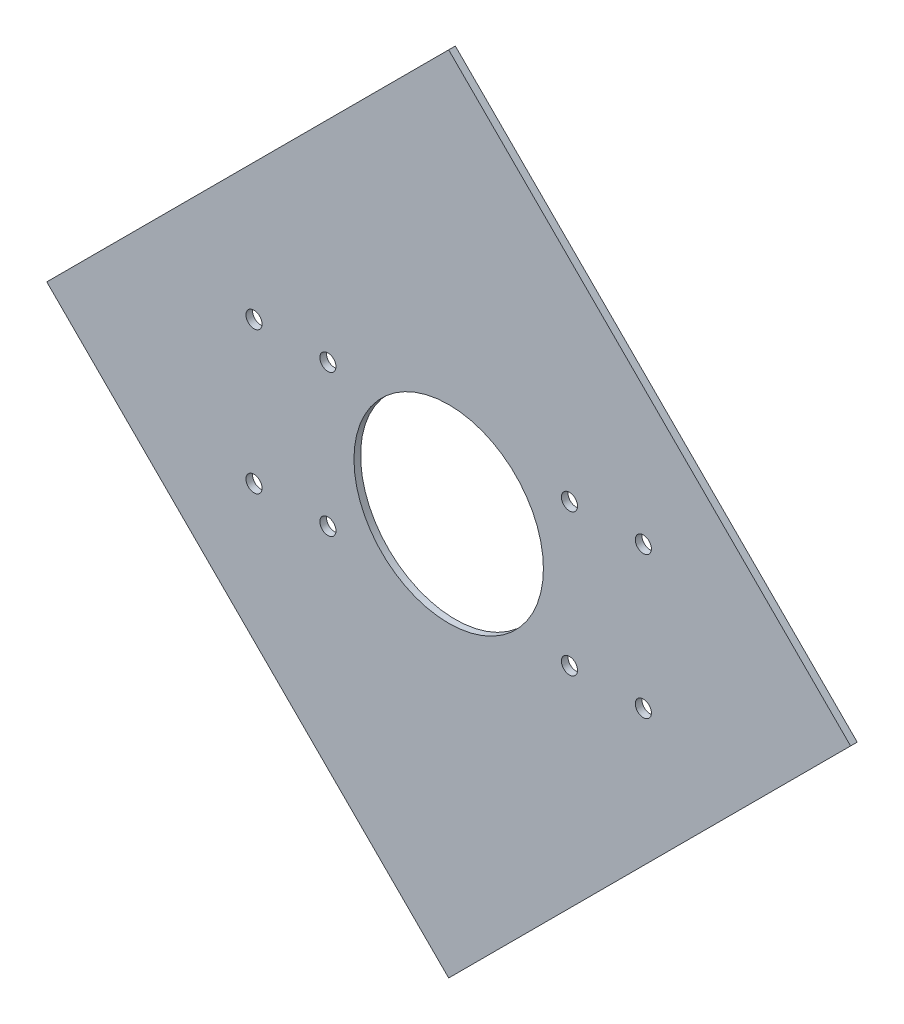
ISO-10303-21;
HEADER;
FILE_DESCRIPTION(('STEP AP214'),'2;1');
FILE_NAME('part.step','',(''),(''),'','','');
FILE_SCHEMA(('AUTOMOTIVE_DESIGN { 1 0 10303 214 1 1 1 1 }'));
ENDSEC;
DATA;
#1=APPLICATION_CONTEXT('core data for automotive mechanical design processes');
#2=APPLICATION_PROTOCOL_DEFINITION('international standard','automotive_design',2000,#1);
#3=PRODUCT_CONTEXT('',#1,'mechanical');
#4=PRODUCT('Part','Part','',(#3));
#5=PRODUCT_RELATED_PRODUCT_CATEGORY('part','',(#4));
#6=PRODUCT_DEFINITION_FORMATION('','',#4);
#7=PRODUCT_DEFINITION_CONTEXT('part definition',#1,'design');
#8=PRODUCT_DEFINITION('design','',#6,#7);
#9=PRODUCT_DEFINITION_SHAPE('','',#8);
#10=(LENGTH_UNIT() NAMED_UNIT(*) SI_UNIT(.MILLI.,.METRE.));
#11=(NAMED_UNIT(*) PLANE_ANGLE_UNIT() SI_UNIT($,.RADIAN.));
#12=(NAMED_UNIT(*) SI_UNIT($,.STERADIAN.) SOLID_ANGLE_UNIT());
#13=UNCERTAINTY_MEASURE_WITH_UNIT(LENGTH_MEASURE(1.E-05),#10,'distance_accuracy_value','');
#14=(GEOMETRIC_REPRESENTATION_CONTEXT(3) GLOBAL_UNCERTAINTY_ASSIGNED_CONTEXT((#13)) GLOBAL_UNIT_ASSIGNED_CONTEXT((#10,
#11,#12)) REPRESENTATION_CONTEXT('',''));
#15=CARTESIAN_POINT('',(0.,0.,0.));
#16=DIRECTION('',(0.,0.,1.));
#17=DIRECTION('',(1.,0.,0.));
#18=AXIS2_PLACEMENT_3D('',#15,#16,#17);
#19=CARTESIAN_POINT('',(0.,0.,-1.4));
#20=DIRECTION('',(-0.707106781186547,-0.707106781186548,0.));
#21=DIRECTION('',(0.707106781186548,-0.707106781186547,0.));
#22=AXIS2_PLACEMENT_3D('',#19,#20,#21);
#23=PLANE('',#22);
#24=DIRECTION('',(0.707106781186548,-0.707106781186547,0.));
#25=VECTOR('',#24,1.);
#26=CARTESIAN_POINT('',(0.,0.,0.));
#27=LINE('',#26,#25);
#28=CARTESIAN_POINT('',(-84.8528137423857,84.8528137423856,0.));
#29=VERTEX_POINT('',#28);
#30=CARTESIAN_POINT('',(0.,0.,0.));
#31=VERTEX_POINT('',#30);
#32=EDGE_CURVE('E106',#29,#31,#27,.T.);
#33=ORIENTED_EDGE('',*,*,#32,.F.);
#34=DIRECTION('',(0.,0.,1.));
#35=VECTOR('',#34,1.);
#36=CARTESIAN_POINT('',(-84.8528137423857,84.8528137423856,-1.4));
#37=LINE('',#36,#35);
#38=CARTESIAN_POINT('',(-84.8528137423857,84.8528137423856,-1.4));
#39=VERTEX_POINT('',#38);
#40=EDGE_CURVE('E11',#39,#29,#37,.T.);
#41=ORIENTED_EDGE('',*,*,#40,.F.);
#42=DIRECTION('',(0.707106781186548,-0.707106781186547,0.));
#43=VECTOR('',#42,1.);
#44=CARTESIAN_POINT('',(0.,0.,-1.4));
#45=LINE('',#44,#43);
#46=CARTESIAN_POINT('',(0.,0.,-1.4));
#47=VERTEX_POINT('',#46);
#48=EDGE_CURVE('E99',#39,#47,#45,.T.);
#49=ORIENTED_EDGE('',*,*,#48,.T.);
#50=DIRECTION('',(0.,0.,1.));
#51=VECTOR('',#50,1.);
#52=CARTESIAN_POINT('',(0.,0.,-1.4));
#53=LINE('',#52,#51);
#54=EDGE_CURVE('E82',#47,#31,#53,.T.);
#55=ORIENTED_EDGE('',*,*,#54,.T.);
#56=EDGE_LOOP('',(#33,#41,#49,#55));
#57=FACE_BOUND('',#56,.T.);
#58=ADVANCED_FACE('F39',(#57),#23,.T.);
#59=CARTESIAN_POINT('',(-84.8528137423857,84.8528137423856,-1.4));
#60=DIRECTION('',(-0.707106781186548,0.707106781186548,0.));
#61=DIRECTION('',(-0.707106781186548,-0.707106781186548,0.));
#62=AXIS2_PLACEMENT_3D('',#59,#60,#61);
#63=PLANE('',#62);
#64=DIRECTION('',(-0.707106781186547,-0.707106781186547,0.));
#65=VECTOR('',#64,1.);
#66=CARTESIAN_POINT('',(-84.8528137423857,84.8528137423856,0.));
#67=LINE('',#66,#65);
#68=CARTESIAN_POINT('',(0.,169.705627484771,0.));
#69=VERTEX_POINT('',#68);
#70=EDGE_CURVE('E101',#69,#29,#67,.T.);
#71=ORIENTED_EDGE('',*,*,#70,.F.);
#72=DIRECTION('',(0.,0.,1.));
#73=VECTOR('',#72,1.);
#74=CARTESIAN_POINT('',(0.,169.705627484771,-1.4));
#75=LINE('',#74,#73);
#76=CARTESIAN_POINT('',(0.,169.705627484771,-1.4));
#77=VERTEX_POINT('',#76);
#78=EDGE_CURVE('E48',#77,#69,#75,.T.);
#79=ORIENTED_EDGE('',*,*,#78,.F.);
#80=DIRECTION('',(-0.707106781186547,-0.707106781186547,0.));
#81=VECTOR('',#80,1.);
#82=CARTESIAN_POINT('',(-84.8528137423857,84.8528137423856,-1.4));
#83=LINE('',#82,#81);
#84=EDGE_CURVE('E96',#77,#39,#83,.T.);
#85=ORIENTED_EDGE('',*,*,#84,.T.);
#86=ORIENTED_EDGE('',*,*,#40,.T.);
#87=EDGE_LOOP('',(#71,#79,#85,#86));
#88=FACE_BOUND('',#87,.T.);
#89=ADVANCED_FACE('F196',(#88),#63,.T.);
#90=CARTESIAN_POINT('',(84.8528137423857,84.8528137423857,-1.4));
#91=DIRECTION('',(0.707106781186547,0.707106781186548,0.));
#92=DIRECTION('',(-0.707106781186548,0.707106781186547,0.));
#93=AXIS2_PLACEMENT_3D('',#90,#91,#92);
#94=PLANE('',#93);
#95=DIRECTION('',(-0.707106781186548,0.707106781186547,0.));
#96=VECTOR('',#95,1.);
#97=CARTESIAN_POINT('',(84.8528137423857,84.8528137423857,0.));
#98=LINE('',#97,#96);
#99=CARTESIAN_POINT('',(84.8528137423857,84.8528137423857,0.));
#100=VERTEX_POINT('',#99);
#101=EDGE_CURVE('E90',#100,#69,#98,.T.);
#102=ORIENTED_EDGE('',*,*,#101,.F.);
#103=DIRECTION('',(0.,0.,1.));
#104=VECTOR('',#103,1.);
#105=CARTESIAN_POINT('',(84.8528137423857,84.8528137423857,-1.4));
#106=LINE('',#105,#104);
#107=CARTESIAN_POINT('',(84.8528137423857,84.8528137423857,-1.4));
#108=VERTEX_POINT('',#107);
#109=EDGE_CURVE('E85',#108,#100,#106,.T.);
#110=ORIENTED_EDGE('',*,*,#109,.F.);
#111=DIRECTION('',(-0.707106781186548,0.707106781186547,0.));
#112=VECTOR('',#111,1.);
#113=CARTESIAN_POINT('',(84.8528137423857,84.8528137423857,-1.4));
#114=LINE('',#113,#112);
#115=EDGE_CURVE('E88',#108,#77,#114,.T.);
#116=ORIENTED_EDGE('',*,*,#115,.T.);
#117=ORIENTED_EDGE('',*,*,#78,.T.);
#118=EDGE_LOOP('',(#102,#110,#116,#117));
#119=FACE_BOUND('',#118,.T.);
#120=ADVANCED_FACE('F87',(#119),#94,.T.);
#121=CARTESIAN_POINT('',(0.,0.,-1.4));
#122=DIRECTION('',(0.707106781186547,-0.707106781186548,0.));
#123=DIRECTION('',(0.707106781186548,0.707106781186547,0.));
#124=AXIS2_PLACEMENT_3D('',#121,#122,#123);
#125=PLANE('',#124);
#126=DIRECTION('',(0.707106781186548,0.707106781186547,0.));
#127=VECTOR('',#126,1.);
#128=CARTESIAN_POINT('',(0.,0.,0.));
#129=LINE('',#128,#127);
#130=EDGE_CURVE('E109',#31,#100,#129,.T.);
#131=ORIENTED_EDGE('',*,*,#130,.F.);
#132=ORIENTED_EDGE('',*,*,#54,.F.);
#133=DIRECTION('',(0.707106781186548,0.707106781186547,0.));
#134=VECTOR('',#133,1.);
#135=CARTESIAN_POINT('',(0.,0.,-1.4));
#136=LINE('',#135,#134);
#137=EDGE_CURVE('E95',#47,#108,#136,.T.);
#138=ORIENTED_EDGE('',*,*,#137,.T.);
#139=ORIENTED_EDGE('',*,*,#109,.T.);
#140=EDGE_LOOP('',(#131,#132,#138,#139));
#141=FACE_BOUND('',#140,.T.);
#142=ADVANCED_FACE('F98',(#141),#125,.T.);
#143=CARTESIAN_POINT('',(0.,0.,-1.4));
#144=DIRECTION('',(0.,0.,-1.));
#145=DIRECTION('',(-1.,0.,0.));
#146=AXIS2_PLACEMENT_3D('',#143,#144,#145);
#147=PLANE('',#146);
#148=CARTESIAN_POINT('',(25.5,99.8528137423857,-1.4));
#149=DIRECTION('',(0.,0.,1.));
#150=DIRECTION('',(1.,0.,0.));
#151=AXIS2_PLACEMENT_3D('',#148,#149,#150);
#152=CIRCLE('',#151,1.7);
#153=CARTESIAN_POINT('',(27.2,99.8528137423857,-1.4));
#154=VERTEX_POINT('',#153);
#155=EDGE_CURVE('E158',#154,#154,#152,.T.);
#156=ORIENTED_EDGE('',*,*,#155,.T.);
#157=EDGE_LOOP('',(#156));
#158=FACE_BOUND('',#157,.T.);
#159=CARTESIAN_POINT('',(-25.5,69.8528137423856,-1.4));
#160=DIRECTION('',(0.,0.,1.));
#161=DIRECTION('',(1.,0.,0.));
#162=AXIS2_PLACEMENT_3D('',#159,#160,#161);
#163=CIRCLE('',#162,1.7);
#164=CARTESIAN_POINT('',(-23.8,69.8528137423856,-1.4));
#165=VERTEX_POINT('',#164);
#166=EDGE_CURVE('E155',#165,#165,#163,.T.);
#167=ORIENTED_EDGE('',*,*,#166,.T.);
#168=EDGE_LOOP('',(#167));
#169=FACE_BOUND('',#168,.T.);
#170=CARTESIAN_POINT('',(-41.1,69.8528137423856,-1.4));
#171=DIRECTION('',(0.,0.,1.));
#172=DIRECTION('',(1.,0.,0.));
#173=AXIS2_PLACEMENT_3D('',#170,#171,#172);
#174=CIRCLE('',#173,1.7);
#175=CARTESIAN_POINT('',(-39.4,69.8528137423856,-1.4));
#176=VERTEX_POINT('',#175);
#177=EDGE_CURVE('E152',#176,#176,#174,.T.);
#178=ORIENTED_EDGE('',*,*,#177,.T.);
#179=EDGE_LOOP('',(#178));
#180=FACE_BOUND('',#179,.T.);
#181=CARTESIAN_POINT('',(-25.5,99.8528137423857,-1.4));
#182=DIRECTION('',(0.,0.,1.));
#183=DIRECTION('',(1.,0.,0.));
#184=AXIS2_PLACEMENT_3D('',#181,#182,#183);
#185=CIRCLE('',#184,1.69999999999998);
#186=CARTESIAN_POINT('',(-23.8,99.8528137423857,-1.4));
#187=VERTEX_POINT('',#186);
#188=EDGE_CURVE('E151',#187,#187,#185,.T.);
#189=ORIENTED_EDGE('',*,*,#188,.T.);
#190=EDGE_LOOP('',(#189));
#191=FACE_BOUND('',#190,.T.);
#192=CARTESIAN_POINT('',(41.1,69.8528137423856,-1.4));
#193=DIRECTION('',(0.,0.,1.));
#194=DIRECTION('',(1.,0.,0.));
#195=AXIS2_PLACEMENT_3D('',#192,#193,#194);
#196=CIRCLE('',#195,1.7);
#197=CARTESIAN_POINT('',(42.8,69.8528137423856,-1.4));
#198=VERTEX_POINT('',#197);
#199=EDGE_CURVE('E167',#198,#198,#196,.T.);
#200=ORIENTED_EDGE('',*,*,#199,.T.);
#201=EDGE_LOOP('',(#200));
#202=FACE_BOUND('',#201,.T.);
#203=CARTESIAN_POINT('',(25.5,69.8528137423856,-1.4));
#204=DIRECTION('',(0.,0.,1.));
#205=DIRECTION('',(1.,0.,0.));
#206=AXIS2_PLACEMENT_3D('',#203,#204,#205);
#207=CIRCLE('',#206,1.7);
#208=CARTESIAN_POINT('',(27.2,69.8528137423856,-1.4));
#209=VERTEX_POINT('',#208);
#210=EDGE_CURVE('E164',#209,#209,#207,.T.);
#211=ORIENTED_EDGE('',*,*,#210,.T.);
#212=EDGE_LOOP('',(#211));
#213=FACE_BOUND('',#212,.T.);
#214=CARTESIAN_POINT('',(41.1,99.8528137423857,-1.4));
#215=DIRECTION('',(0.,0.,1.));
#216=DIRECTION('',(1.,0.,0.));
#217=AXIS2_PLACEMENT_3D('',#214,#215,#216);
#218=CIRCLE('',#217,1.69999999999999);
#219=CARTESIAN_POINT('',(42.8,99.8528137423857,-1.4));
#220=VERTEX_POINT('',#219);
#221=EDGE_CURVE('E161',#220,#220,#218,.T.);
#222=ORIENTED_EDGE('',*,*,#221,.T.);
#223=EDGE_LOOP('',(#222));
#224=FACE_BOUND('',#223,.T.);
#225=CARTESIAN_POINT('',(-41.1,99.8528137423857,-1.4));
#226=DIRECTION('',(0.,0.,1.));
#227=DIRECTION('',(1.,0.,0.));
#228=AXIS2_PLACEMENT_3D('',#225,#226,#227);
#229=CIRCLE('',#228,1.7);
#230=CARTESIAN_POINT('',(-39.4,99.8528137423857,-1.4));
#231=VERTEX_POINT('',#230);
#232=EDGE_CURVE('E124',#231,#231,#229,.T.);
#233=ORIENTED_EDGE('',*,*,#232,.T.);
#234=EDGE_LOOP('',(#233));
#235=FACE_BOUND('',#234,.T.);
#236=CARTESIAN_POINT('',(0.,84.8528137423856,-1.4));
#237=DIRECTION('',(0.,0.,1.));
#238=DIRECTION('',(1.,0.,0.));
#239=AXIS2_PLACEMENT_3D('',#236,#237,#238);
#240=CIRCLE('',#239,20.);
#241=CARTESIAN_POINT('',(20.,84.8528137423856,-1.4));
#242=VERTEX_POINT('',#241);
#243=EDGE_CURVE('E119',#242,#242,#240,.T.);
#244=ORIENTED_EDGE('',*,*,#243,.T.);
#245=EDGE_LOOP('',(#244));
#246=FACE_BOUND('',#245,.T.);
#247=ORIENTED_EDGE('',*,*,#48,.F.);
#248=ORIENTED_EDGE('',*,*,#84,.F.);
#249=ORIENTED_EDGE('',*,*,#115,.F.);
#250=ORIENTED_EDGE('',*,*,#137,.F.);
#251=EDGE_LOOP('',(#247,#248,#249,#250));
#252=FACE_BOUND('',#251,.T.);
#253=ADVANCED_FACE('F94',(#158,#169,#180,#191,#202,#213,#224,#235,#246,#252),#147,.T.);
#254=CARTESIAN_POINT('',(0.,0.,0.));
#255=DIRECTION('',(0.,0.,-1.));
#256=DIRECTION('',(-1.,0.,0.));
#257=AXIS2_PLACEMENT_3D('',#254,#255,#256);
#258=PLANE('',#257);
#259=CARTESIAN_POINT('',(25.5,99.8528137423857,0.));
#260=DIRECTION('',(0.,0.,-1.));
#261=DIRECTION('',(-1.,0.,0.));
#262=AXIS2_PLACEMENT_3D('',#259,#260,#261);
#263=CIRCLE('',#262,1.7);
#264=CARTESIAN_POINT('',(23.8,99.8528137423857,0.));
#265=VERTEX_POINT('',#264);
#266=EDGE_CURVE('E42',#265,#265,#263,.T.);
#267=ORIENTED_EDGE('',*,*,#266,.T.);
#268=EDGE_LOOP('',(#267));
#269=FACE_BOUND('',#268,.T.);
#270=CARTESIAN_POINT('',(-25.5,69.8528137423856,0.));
#271=DIRECTION('',(0.,0.,-1.));
#272=DIRECTION('',(-1.,0.,0.));
#273=AXIS2_PLACEMENT_3D('',#270,#271,#272);
#274=CIRCLE('',#273,1.7);
#275=CARTESIAN_POINT('',(-27.2,69.8528137423856,0.));
#276=VERTEX_POINT('',#275);
#277=EDGE_CURVE('E138',#276,#276,#274,.T.);
#278=ORIENTED_EDGE('',*,*,#277,.T.);
#279=EDGE_LOOP('',(#278));
#280=FACE_BOUND('',#279,.T.);
#281=CARTESIAN_POINT('',(-41.1,69.8528137423856,0.));
#282=DIRECTION('',(0.,0.,-1.));
#283=DIRECTION('',(-1.,0.,0.));
#284=AXIS2_PLACEMENT_3D('',#281,#282,#283);
#285=CIRCLE('',#284,1.7);
#286=CARTESIAN_POINT('',(-42.8,69.8528137423856,0.));
#287=VERTEX_POINT('',#286);
#288=EDGE_CURVE('E136',#287,#287,#285,.T.);
#289=ORIENTED_EDGE('',*,*,#288,.T.);
#290=EDGE_LOOP('',(#289));
#291=FACE_BOUND('',#290,.T.);
#292=CARTESIAN_POINT('',(-25.5,99.8528137423857,0.));
#293=DIRECTION('',(0.,0.,-1.));
#294=DIRECTION('',(-1.,0.,0.));
#295=AXIS2_PLACEMENT_3D('',#292,#293,#294);
#296=CIRCLE('',#295,1.69999999999998);
#297=CARTESIAN_POINT('',(-27.2,99.8528137423857,0.));
#298=VERTEX_POINT('',#297);
#299=EDGE_CURVE('E133',#298,#298,#296,.T.);
#300=ORIENTED_EDGE('',*,*,#299,.T.);
#301=EDGE_LOOP('',(#300));
#302=FACE_BOUND('',#301,.T.);
#303=CARTESIAN_POINT('',(41.1,69.8528137423856,0.));
#304=DIRECTION('',(0.,0.,-1.));
#305=DIRECTION('',(-1.,0.,0.));
#306=AXIS2_PLACEMENT_3D('',#303,#304,#305);
#307=CIRCLE('',#306,1.7);
#308=CARTESIAN_POINT('',(39.4,69.8528137423856,0.));
#309=VERTEX_POINT('',#308);
#310=EDGE_CURVE('E130',#309,#309,#307,.T.);
#311=ORIENTED_EDGE('',*,*,#310,.T.);
#312=EDGE_LOOP('',(#311));
#313=FACE_BOUND('',#312,.T.);
#314=CARTESIAN_POINT('',(25.5,69.8528137423856,0.));
#315=DIRECTION('',(0.,0.,-1.));
#316=DIRECTION('',(-1.,0.,0.));
#317=AXIS2_PLACEMENT_3D('',#314,#315,#316);
#318=CIRCLE('',#317,1.7);
#319=CARTESIAN_POINT('',(23.8,69.8528137423856,0.));
#320=VERTEX_POINT('',#319);
#321=EDGE_CURVE('E127',#320,#320,#318,.T.);
#322=ORIENTED_EDGE('',*,*,#321,.T.);
#323=EDGE_LOOP('',(#322));
#324=FACE_BOUND('',#323,.T.);
#325=CARTESIAN_POINT('',(41.1,99.8528137423857,0.));
#326=DIRECTION('',(0.,0.,-1.));
#327=DIRECTION('',(-1.,0.,0.));
#328=AXIS2_PLACEMENT_3D('',#325,#326,#327);
#329=CIRCLE('',#328,1.69999999999999);
#330=CARTESIAN_POINT('',(39.4,99.8528137423857,0.));
#331=VERTEX_POINT('',#330);
#332=EDGE_CURVE('E123',#331,#331,#329,.T.);
#333=ORIENTED_EDGE('',*,*,#332,.T.);
#334=EDGE_LOOP('',(#333));
#335=FACE_BOUND('',#334,.T.);
#336=CARTESIAN_POINT('',(-41.1,99.8528137423857,0.));
#337=DIRECTION('',(0.,0.,-1.));
#338=DIRECTION('',(-1.,0.,0.));
#339=AXIS2_PLACEMENT_3D('',#336,#337,#338);
#340=CIRCLE('',#339,1.7);
#341=CARTESIAN_POINT('',(-42.8,99.8528137423857,0.));
#342=VERTEX_POINT('',#341);
#343=EDGE_CURVE('E120',#342,#342,#340,.T.);
#344=ORIENTED_EDGE('',*,*,#343,.T.);
#345=EDGE_LOOP('',(#344));
#346=FACE_BOUND('',#345,.T.);
#347=CARTESIAN_POINT('',(0.,84.8528137423856,0.));
#348=DIRECTION('',(0.,0.,-1.));
#349=DIRECTION('',(-1.,0.,0.));
#350=AXIS2_PLACEMENT_3D('',#347,#348,#349);
#351=CIRCLE('',#350,20.);
#352=CARTESIAN_POINT('',(-20.,84.8528137423856,0.));
#353=VERTEX_POINT('',#352);
#354=EDGE_CURVE('E110',#353,#353,#351,.T.);
#355=ORIENTED_EDGE('',*,*,#354,.T.);
#356=EDGE_LOOP('',(#355));
#357=FACE_BOUND('',#356,.T.);
#358=ORIENTED_EDGE('',*,*,#32,.T.);
#359=ORIENTED_EDGE('',*,*,#130,.T.);
#360=ORIENTED_EDGE('',*,*,#101,.T.);
#361=ORIENTED_EDGE('',*,*,#70,.T.);
#362=EDGE_LOOP('',(#358,#359,#360,#361));
#363=FACE_BOUND('',#362,.T.);
#364=ADVANCED_FACE('F183',(#269,#280,#291,#302,#313,#324,#335,#346,#357,#363),#258,.F.);
#365=CARTESIAN_POINT('',(0.,84.8528137423856,-1.4));
#366=DIRECTION('',(0.,0.,1.));
#367=DIRECTION('',(1.,0.,0.));
#368=AXIS2_PLACEMENT_3D('',#365,#366,#367);
#369=CYLINDRICAL_SURFACE('',#368,20.);
#370=ORIENTED_EDGE('',*,*,#243,.F.);
#371=EDGE_LOOP('',(#370));
#372=FACE_BOUND('',#371,.T.);
#373=ORIENTED_EDGE('',*,*,#354,.F.);
#374=EDGE_LOOP('',(#373));
#375=FACE_BOUND('',#374,.T.);
#376=ADVANCED_FACE('F186',(#372,#375),#369,.F.);
#377=CARTESIAN_POINT('',(-41.1,99.8528137423857,-1.4));
#378=DIRECTION('',(0.,0.,1.));
#379=DIRECTION('',(1.,0.,0.));
#380=AXIS2_PLACEMENT_3D('',#377,#378,#379);
#381=CYLINDRICAL_SURFACE('',#380,1.7);
#382=ORIENTED_EDGE('',*,*,#232,.F.);
#383=EDGE_LOOP('',(#382));
#384=FACE_BOUND('',#383,.T.);
#385=ORIENTED_EDGE('',*,*,#343,.F.);
#386=EDGE_LOOP('',(#385));
#387=FACE_BOUND('',#386,.T.);
#388=ADVANCED_FACE('F216',(#384,#387),#381,.F.);
#389=CARTESIAN_POINT('',(41.1,99.8528137423857,-1.4));
#390=DIRECTION('',(0.,0.,1.));
#391=DIRECTION('',(1.,0.,0.));
#392=AXIS2_PLACEMENT_3D('',#389,#390,#391);
#393=CYLINDRICAL_SURFACE('',#392,1.69999999999999);
#394=ORIENTED_EDGE('',*,*,#221,.F.);
#395=EDGE_LOOP('',(#394));
#396=FACE_BOUND('',#395,.T.);
#397=ORIENTED_EDGE('',*,*,#332,.F.);
#398=EDGE_LOOP('',(#397));
#399=FACE_BOUND('',#398,.T.);
#400=ADVANCED_FACE('F220',(#396,#399),#393,.F.);
#401=CARTESIAN_POINT('',(25.5,69.8528137423856,-1.4));
#402=DIRECTION('',(0.,0.,1.));
#403=DIRECTION('',(1.,0.,0.));
#404=AXIS2_PLACEMENT_3D('',#401,#402,#403);
#405=CYLINDRICAL_SURFACE('',#404,1.7);
#406=ORIENTED_EDGE('',*,*,#210,.F.);
#407=EDGE_LOOP('',(#406));
#408=FACE_BOUND('',#407,.T.);
#409=ORIENTED_EDGE('',*,*,#321,.F.);
#410=EDGE_LOOP('',(#409));
#411=FACE_BOUND('',#410,.T.);
#412=ADVANCED_FACE('F179',(#408,#411),#405,.F.);
#413=CARTESIAN_POINT('',(41.1,69.8528137423856,-1.4));
#414=DIRECTION('',(0.,0.,1.));
#415=DIRECTION('',(1.,0.,0.));
#416=AXIS2_PLACEMENT_3D('',#413,#414,#415);
#417=CYLINDRICAL_SURFACE('',#416,1.7);
#418=ORIENTED_EDGE('',*,*,#199,.F.);
#419=EDGE_LOOP('',(#418));
#420=FACE_BOUND('',#419,.T.);
#421=ORIENTED_EDGE('',*,*,#310,.F.);
#422=EDGE_LOOP('',(#421));
#423=FACE_BOUND('',#422,.T.);
#424=ADVANCED_FACE('F175',(#420,#423),#417,.F.);
#425=CARTESIAN_POINT('',(-25.5,99.8528137423857,-1.4));
#426=DIRECTION('',(0.,0.,1.));
#427=DIRECTION('',(1.,0.,0.));
#428=AXIS2_PLACEMENT_3D('',#425,#426,#427);
#429=CYLINDRICAL_SURFACE('',#428,1.69999999999998);
#430=ORIENTED_EDGE('',*,*,#188,.F.);
#431=EDGE_LOOP('',(#430));
#432=FACE_BOUND('',#431,.T.);
#433=ORIENTED_EDGE('',*,*,#299,.F.);
#434=EDGE_LOOP('',(#433));
#435=FACE_BOUND('',#434,.T.);
#436=ADVANCED_FACE('F178',(#432,#435),#429,.F.);
#437=CARTESIAN_POINT('',(-41.1,69.8528137423856,-1.4));
#438=DIRECTION('',(0.,0.,1.));
#439=DIRECTION('',(1.,0.,0.));
#440=AXIS2_PLACEMENT_3D('',#437,#438,#439);
#441=CYLINDRICAL_SURFACE('',#440,1.7);
#442=ORIENTED_EDGE('',*,*,#177,.F.);
#443=EDGE_LOOP('',(#442));
#444=FACE_BOUND('',#443,.T.);
#445=ORIENTED_EDGE('',*,*,#288,.F.);
#446=EDGE_LOOP('',(#445));
#447=FACE_BOUND('',#446,.T.);
#448=ADVANCED_FACE('F222',(#444,#447),#441,.F.);
#449=CARTESIAN_POINT('',(-25.5,69.8528137423856,-1.4));
#450=DIRECTION('',(0.,0.,1.));
#451=DIRECTION('',(1.,0.,0.));
#452=AXIS2_PLACEMENT_3D('',#449,#450,#451);
#453=CYLINDRICAL_SURFACE('',#452,1.7);
#454=ORIENTED_EDGE('',*,*,#166,.F.);
#455=EDGE_LOOP('',(#454));
#456=FACE_BOUND('',#455,.T.);
#457=ORIENTED_EDGE('',*,*,#277,.F.);
#458=EDGE_LOOP('',(#457));
#459=FACE_BOUND('',#458,.T.);
#460=ADVANCED_FACE('F225',(#456,#459),#453,.F.);
#461=CARTESIAN_POINT('',(25.5,99.8528137423857,-1.4));
#462=DIRECTION('',(0.,0.,1.));
#463=DIRECTION('',(1.,0.,0.));
#464=AXIS2_PLACEMENT_3D('',#461,#462,#463);
#465=CYLINDRICAL_SURFACE('',#464,1.7);
#466=ORIENTED_EDGE('',*,*,#155,.F.);
#467=EDGE_LOOP('',(#466));
#468=FACE_BOUND('',#467,.T.);
#469=ORIENTED_EDGE('',*,*,#266,.F.);
#470=EDGE_LOOP('',(#469));
#471=FACE_BOUND('',#470,.T.);
#472=ADVANCED_FACE('F230',(#468,#471),#465,.F.);
#473=CLOSED_SHELL('',(#58,#89,#120,#142,#253,#364,#376,#388,#400,#412,#424,#436,#448,#460,#472));
#474=MANIFOLD_SOLID_BREP('B2',#473);
#475=ADVANCED_BREP_SHAPE_REPRESENTATION('',(#18,#474),#14);
#476=SHAPE_DEFINITION_REPRESENTATION(#9,#475);
ENDSEC;
END-ISO-10303-21;
